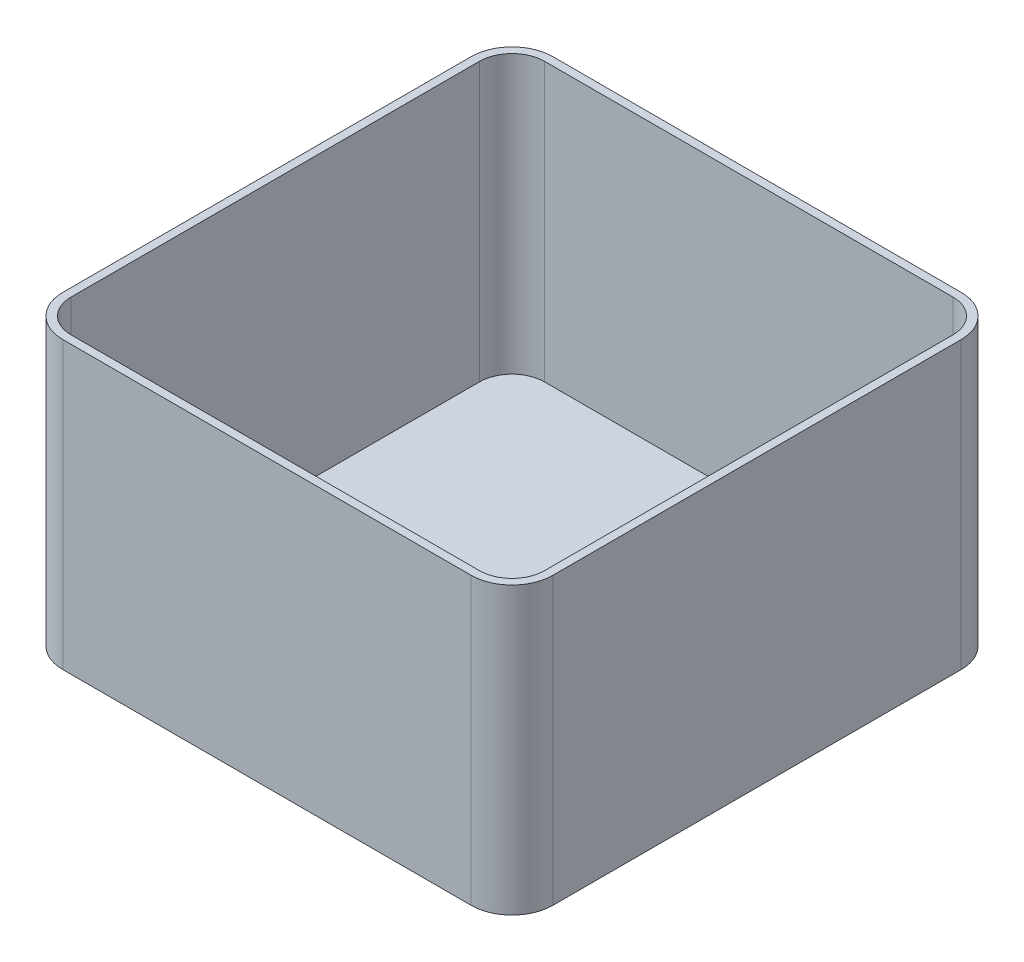
ISO-10303-21;
HEADER;
FILE_DESCRIPTION(('STEP AP214'),'2;1');
FILE_NAME('part.step','',(''),(''),'','','');
FILE_SCHEMA(('AUTOMOTIVE_DESIGN { 1 0 10303 214 1 1 1 1 }'));
ENDSEC;
DATA;
#1=APPLICATION_CONTEXT('core data for automotive mechanical design processes');
#2=APPLICATION_PROTOCOL_DEFINITION('international standard','automotive_design',2000,#1);
#3=PRODUCT_CONTEXT('',#1,'mechanical');
#4=PRODUCT('Part','Part','',(#3));
#5=PRODUCT_RELATED_PRODUCT_CATEGORY('part','',(#4));
#6=PRODUCT_DEFINITION_FORMATION('','',#4);
#7=PRODUCT_DEFINITION_CONTEXT('part definition',#1,'design');
#8=PRODUCT_DEFINITION('design','',#6,#7);
#9=PRODUCT_DEFINITION_SHAPE('','',#8);
#10=(LENGTH_UNIT() NAMED_UNIT(*) SI_UNIT(.MILLI.,.METRE.));
#11=(NAMED_UNIT(*) PLANE_ANGLE_UNIT() SI_UNIT($,.RADIAN.));
#12=(NAMED_UNIT(*) SI_UNIT($,.STERADIAN.) SOLID_ANGLE_UNIT());
#13=UNCERTAINTY_MEASURE_WITH_UNIT(LENGTH_MEASURE(1.E-05),#10,'distance_accuracy_value','');
#14=(GEOMETRIC_REPRESENTATION_CONTEXT(3) GLOBAL_UNCERTAINTY_ASSIGNED_CONTEXT((#13)) GLOBAL_UNIT_ASSIGNED_CONTEXT((#10,
#11,#12)) REPRESENTATION_CONTEXT('',''));
#15=CARTESIAN_POINT('',(0.,0.,0.));
#16=DIRECTION('',(0.,0.,1.));
#17=DIRECTION('',(1.,0.,0.));
#18=AXIS2_PLACEMENT_3D('',#15,#16,#17);
#19=CARTESIAN_POINT('',(-25.,35.,25.));
#20=DIRECTION('',(0.,-1.,0.));
#21=DIRECTION('',(0.,0.,-1.));
#22=AXIS2_PLACEMENT_3D('',#19,#20,#21);
#23=PLANE('',#22);
#24=CARTESIAN_POINT('',(-25.,35.,25.));
#25=DIRECTION('',(0.,1.,0.));
#26=DIRECTION('',(0.,0.,-1.));
#27=AXIS2_PLACEMENT_3D('',#24,#25,#26);
#28=CIRCLE('',#27,5.);
#29=CARTESIAN_POINT('',(-30.,35.,25.));
#30=VERTEX_POINT('',#29);
#31=CARTESIAN_POINT('',(-25.,35.,30.));
#32=VERTEX_POINT('',#31);
#33=EDGE_CURVE('E157',#30,#32,#28,.T.);
#34=ORIENTED_EDGE('',*,*,#33,.T.);
#35=DIRECTION('',(1.,0.,0.));
#36=VECTOR('',#35,1.);
#37=CARTESIAN_POINT('',(-25.,35.,30.));
#38=LINE('',#37,#36);
#39=CARTESIAN_POINT('',(25.,35.,30.));
#40=VERTEX_POINT('',#39);
#41=EDGE_CURVE('E98',#32,#40,#38,.T.);
#42=ORIENTED_EDGE('',*,*,#41,.T.);
#43=CARTESIAN_POINT('',(25.,35.,25.));
#44=DIRECTION('',(0.,1.,0.));
#45=DIRECTION('',(0.,0.,1.));
#46=AXIS2_PLACEMENT_3D('',#43,#44,#45);
#47=CIRCLE('',#46,5.);
#48=CARTESIAN_POINT('',(30.,35.,25.));
#49=VERTEX_POINT('',#48);
#50=EDGE_CURVE('E172',#40,#49,#47,.T.);
#51=ORIENTED_EDGE('',*,*,#50,.T.);
#52=DIRECTION('',(0.,0.,-1.));
#53=VECTOR('',#52,1.);
#54=CARTESIAN_POINT('',(30.,35.,25.));
#55=LINE('',#54,#53);
#56=CARTESIAN_POINT('',(30.,35.,-25.));
#57=VERTEX_POINT('',#56);
#58=EDGE_CURVE('E184',#49,#57,#55,.T.);
#59=ORIENTED_EDGE('',*,*,#58,.T.);
#60=CARTESIAN_POINT('',(25.,35.,-25.));
#61=DIRECTION('',(0.,1.,0.));
#62=DIRECTION('',(0.,0.,-1.));
#63=AXIS2_PLACEMENT_3D('',#60,#61,#62);
#64=CIRCLE('',#63,5.);
#65=CARTESIAN_POINT('',(25.,35.,-30.));
#66=VERTEX_POINT('',#65);
#67=EDGE_CURVE('E120',#57,#66,#64,.T.);
#68=ORIENTED_EDGE('',*,*,#67,.T.);
#69=DIRECTION('',(-1.,0.,0.));
#70=VECTOR('',#69,1.);
#71=CARTESIAN_POINT('',(-25.,35.,-30.));
#72=LINE('',#71,#70);
#73=CARTESIAN_POINT('',(-25.,35.,-30.));
#74=VERTEX_POINT('',#73);
#75=EDGE_CURVE('E113',#66,#74,#72,.T.);
#76=ORIENTED_EDGE('',*,*,#75,.T.);
#77=CARTESIAN_POINT('',(-25.,35.,-25.));
#78=DIRECTION('',(0.,1.,0.));
#79=DIRECTION('',(0.,0.,-1.));
#80=AXIS2_PLACEMENT_3D('',#77,#78,#79);
#81=CIRCLE('',#80,5.);
#82=CARTESIAN_POINT('',(-30.,35.,-25.));
#83=VERTEX_POINT('',#82);
#84=EDGE_CURVE('E117',#74,#83,#81,.T.);
#85=ORIENTED_EDGE('',*,*,#84,.T.);
#86=DIRECTION('',(0.,0.,1.));
#87=VECTOR('',#86,1.);
#88=CARTESIAN_POINT('',(-30.,35.,25.));
#89=LINE('',#88,#87);
#90=EDGE_CURVE('E57',#83,#30,#89,.T.);
#91=ORIENTED_EDGE('',*,*,#90,.T.);
#92=EDGE_LOOP('',(#34,#42,#51,#59,#68,#76,#85,#91));
#93=FACE_BOUND('',#92,.T.);
#94=CARTESIAN_POINT('',(-25.,35.,25.));
#95=DIRECTION('',(0.,-1.,0.));
#96=DIRECTION('',(0.,0.,-1.));
#97=AXIS2_PLACEMENT_3D('',#94,#95,#96);
#98=CIRCLE('',#97,4.);
#99=CARTESIAN_POINT('',(-29.,35.,25.));
#100=VERTEX_POINT('',#99);
#101=CARTESIAN_POINT('',(-25.,35.,29.));
#102=VERTEX_POINT('',#101);
#103=EDGE_CURVE('E210',#100,#102,#98,.F.);
#104=ORIENTED_EDGE('',*,*,#103,.F.);
#105=DIRECTION('',(0.,0.,1.));
#106=VECTOR('',#105,1.);
#107=CARTESIAN_POINT('',(-29.,35.,25.));
#108=LINE('',#107,#106);
#109=CARTESIAN_POINT('',(-29.,35.,-25.));
#110=VERTEX_POINT('',#109);
#111=EDGE_CURVE('E190',#110,#100,#108,.T.);
#112=ORIENTED_EDGE('',*,*,#111,.F.);
#113=CARTESIAN_POINT('',(-25.,35.,-25.));
#114=DIRECTION('',(0.,-1.,0.));
#115=DIRECTION('',(0.,0.,-1.));
#116=AXIS2_PLACEMENT_3D('',#113,#114,#115);
#117=CIRCLE('',#116,4.);
#118=CARTESIAN_POINT('',(-25.,35.,-29.));
#119=VERTEX_POINT('',#118);
#120=EDGE_CURVE('E193',#119,#110,#117,.F.);
#121=ORIENTED_EDGE('',*,*,#120,.F.);
#122=DIRECTION('',(-1.,0.,0.));
#123=VECTOR('',#122,1.);
#124=CARTESIAN_POINT('',(-25.,35.,-29.));
#125=LINE('',#124,#123);
#126=CARTESIAN_POINT('',(25.,35.,-29.));
#127=VERTEX_POINT('',#126);
#128=EDGE_CURVE('E195',#127,#119,#125,.T.);
#129=ORIENTED_EDGE('',*,*,#128,.F.);
#130=CARTESIAN_POINT('',(25.,35.,-25.));
#131=DIRECTION('',(0.,-1.,0.));
#132=DIRECTION('',(0.,0.,-1.));
#133=AXIS2_PLACEMENT_3D('',#130,#131,#132);
#134=CIRCLE('',#133,4.);
#135=CARTESIAN_POINT('',(29.,35.,-25.));
#136=VERTEX_POINT('',#135);
#137=EDGE_CURVE('E198',#136,#127,#134,.F.);
#138=ORIENTED_EDGE('',*,*,#137,.F.);
#139=DIRECTION('',(0.,0.,-1.));
#140=VECTOR('',#139,1.);
#141=CARTESIAN_POINT('',(29.,35.,25.));
#142=LINE('',#141,#140);
#143=CARTESIAN_POINT('',(29.,35.,25.));
#144=VERTEX_POINT('',#143);
#145=EDGE_CURVE('E201',#144,#136,#142,.T.);
#146=ORIENTED_EDGE('',*,*,#145,.F.);
#147=CARTESIAN_POINT('',(25.,35.,25.));
#148=DIRECTION('',(0.,-1.,0.));
#149=DIRECTION('',(0.,0.,-1.));
#150=AXIS2_PLACEMENT_3D('',#147,#148,#149);
#151=CIRCLE('',#150,4.);
#152=CARTESIAN_POINT('',(25.,35.,29.));
#153=VERTEX_POINT('',#152);
#154=EDGE_CURVE('E204',#153,#144,#151,.F.);
#155=ORIENTED_EDGE('',*,*,#154,.F.);
#156=DIRECTION('',(1.,0.,0.));
#157=VECTOR('',#156,1.);
#158=CARTESIAN_POINT('',(-25.,35.,29.));
#159=LINE('',#158,#157);
#160=EDGE_CURVE('E207',#102,#153,#159,.T.);
#161=ORIENTED_EDGE('',*,*,#160,.F.);
#162=EDGE_LOOP('',(#104,#112,#121,#129,#138,#146,#155,#161));
#163=FACE_BOUND('',#162,.T.);
#164=ADVANCED_FACE('F33',(#93,#163),#23,.F.);
#165=CARTESIAN_POINT('',(-25.,35.,25.));
#166=DIRECTION('',(0.,-1.,0.));
#167=DIRECTION('',(0.,0.,-1.));
#168=AXIS2_PLACEMENT_3D('',#165,#166,#167);
#169=CYLINDRICAL_SURFACE('',#168,5.);
#170=CARTESIAN_POINT('',(-25.,0.,25.));
#171=DIRECTION('',(0.,1.,0.));
#172=DIRECTION('',(0.,0.,-1.));
#173=AXIS2_PLACEMENT_3D('',#170,#171,#172);
#174=CIRCLE('',#173,5.);
#175=CARTESIAN_POINT('',(-30.,0.,25.));
#176=VERTEX_POINT('',#175);
#177=CARTESIAN_POINT('',(-25.,0.,30.));
#178=VERTEX_POINT('',#177);
#179=EDGE_CURVE('E141',#176,#178,#174,.T.);
#180=ORIENTED_EDGE('',*,*,#179,.T.);
#181=DIRECTION('',(0.,-1.,0.));
#182=VECTOR('',#181,1.);
#183=CARTESIAN_POINT('',(-25.,35.,30.));
#184=LINE('',#183,#182);
#185=EDGE_CURVE('E11',#32,#178,#184,.T.);
#186=ORIENTED_EDGE('',*,*,#185,.F.);
#187=ORIENTED_EDGE('',*,*,#33,.F.);
#188=DIRECTION('',(0.,-1.,0.));
#189=VECTOR('',#188,1.);
#190=CARTESIAN_POINT('',(-30.,35.,25.));
#191=LINE('',#190,#189);
#192=EDGE_CURVE('E137',#30,#176,#191,.T.);
#193=ORIENTED_EDGE('',*,*,#192,.T.);
#194=EDGE_LOOP('',(#180,#186,#187,#193));
#195=FACE_BOUND('',#194,.T.);
#196=ADVANCED_FACE('F35',(#195),#169,.T.);
#197=CARTESIAN_POINT('',(-25.,35.,30.));
#198=DIRECTION('',(0.,0.,-1.));
#199=DIRECTION('',(-1.,0.,0.));
#200=AXIS2_PLACEMENT_3D('',#197,#198,#199);
#201=PLANE('',#200);
#202=DIRECTION('',(1.,0.,0.));
#203=VECTOR('',#202,1.);
#204=CARTESIAN_POINT('',(-25.,0.,30.));
#205=LINE('',#204,#203);
#206=CARTESIAN_POINT('',(25.,0.,30.));
#207=VERTEX_POINT('',#206);
#208=EDGE_CURVE('E144',#178,#207,#205,.T.);
#209=ORIENTED_EDGE('',*,*,#208,.T.);
#210=DIRECTION('',(0.,-1.,0.));
#211=VECTOR('',#210,1.);
#212=CARTESIAN_POINT('',(25.,35.,30.));
#213=LINE('',#212,#211);
#214=EDGE_CURVE('E41',#40,#207,#213,.T.);
#215=ORIENTED_EDGE('',*,*,#214,.F.);
#216=ORIENTED_EDGE('',*,*,#41,.F.);
#217=ORIENTED_EDGE('',*,*,#185,.T.);
#218=EDGE_LOOP('',(#209,#215,#216,#217));
#219=FACE_BOUND('',#218,.T.);
#220=ADVANCED_FACE('F329',(#219),#201,.F.);
#221=CARTESIAN_POINT('',(25.,35.,25.));
#222=DIRECTION('',(0.,-1.,0.));
#223=DIRECTION('',(0.,0.,-1.));
#224=AXIS2_PLACEMENT_3D('',#221,#222,#223);
#225=CYLINDRICAL_SURFACE('',#224,5.);
#226=CARTESIAN_POINT('',(25.,0.,25.));
#227=DIRECTION('',(0.,1.,0.));
#228=DIRECTION('',(0.,0.,1.));
#229=AXIS2_PLACEMENT_3D('',#226,#227,#228);
#230=CIRCLE('',#229,5.);
#231=CARTESIAN_POINT('',(30.,0.,25.));
#232=VERTEX_POINT('',#231);
#233=EDGE_CURVE('E147',#207,#232,#230,.T.);
#234=ORIENTED_EDGE('',*,*,#233,.T.);
#235=DIRECTION('',(0.,-1.,0.));
#236=VECTOR('',#235,1.);
#237=CARTESIAN_POINT('',(30.,35.,25.));
#238=LINE('',#237,#236);
#239=EDGE_CURVE('E164',#49,#232,#238,.T.);
#240=ORIENTED_EDGE('',*,*,#239,.F.);
#241=ORIENTED_EDGE('',*,*,#50,.F.);
#242=ORIENTED_EDGE('',*,*,#214,.T.);
#243=EDGE_LOOP('',(#234,#240,#241,#242));
#244=FACE_BOUND('',#243,.T.);
#245=ADVANCED_FACE('F170',(#244),#225,.T.);
#246=CARTESIAN_POINT('',(30.,35.,25.));
#247=DIRECTION('',(-1.,0.,0.));
#248=DIRECTION('',(0.,0.,1.));
#249=AXIS2_PLACEMENT_3D('',#246,#247,#248);
#250=PLANE('',#249);
#251=DIRECTION('',(0.,0.,-1.));
#252=VECTOR('',#251,1.);
#253=CARTESIAN_POINT('',(30.,0.,25.));
#254=LINE('',#253,#252);
#255=CARTESIAN_POINT('',(30.,0.,-25.));
#256=VERTEX_POINT('',#255);
#257=EDGE_CURVE('E149',#232,#256,#254,.T.);
#258=ORIENTED_EDGE('',*,*,#257,.T.);
#259=DIRECTION('',(0.,-1.,0.));
#260=VECTOR('',#259,1.);
#261=CARTESIAN_POINT('',(30.,35.,-25.));
#262=LINE('',#261,#260);
#263=EDGE_CURVE('E161',#57,#256,#262,.T.);
#264=ORIENTED_EDGE('',*,*,#263,.F.);
#265=ORIENTED_EDGE('',*,*,#58,.F.);
#266=ORIENTED_EDGE('',*,*,#239,.T.);
#267=EDGE_LOOP('',(#258,#264,#265,#266));
#268=FACE_BOUND('',#267,.T.);
#269=ADVANCED_FACE('F180',(#268),#250,.F.);
#270=CARTESIAN_POINT('',(25.,35.,-25.));
#271=DIRECTION('',(0.,-1.,0.));
#272=DIRECTION('',(0.,0.,-1.));
#273=AXIS2_PLACEMENT_3D('',#270,#271,#272);
#274=CYLINDRICAL_SURFACE('',#273,5.);
#275=CARTESIAN_POINT('',(25.,0.,-25.));
#276=DIRECTION('',(0.,1.,0.));
#277=DIRECTION('',(0.,0.,-1.));
#278=AXIS2_PLACEMENT_3D('',#275,#276,#277);
#279=CIRCLE('',#278,5.);
#280=CARTESIAN_POINT('',(25.,0.,-30.));
#281=VERTEX_POINT('',#280);
#282=EDGE_CURVE('E151',#256,#281,#279,.T.);
#283=ORIENTED_EDGE('',*,*,#282,.T.);
#284=DIRECTION('',(0.,-1.,0.));
#285=VECTOR('',#284,1.);
#286=CARTESIAN_POINT('',(25.,35.,-30.));
#287=LINE('',#286,#285);
#288=EDGE_CURVE('E132',#66,#281,#287,.T.);
#289=ORIENTED_EDGE('',*,*,#288,.F.);
#290=ORIENTED_EDGE('',*,*,#67,.F.);
#291=ORIENTED_EDGE('',*,*,#263,.T.);
#292=EDGE_LOOP('',(#283,#289,#290,#291));
#293=FACE_BOUND('',#292,.T.);
#294=ADVANCED_FACE('F183',(#293),#274,.T.);
#295=CARTESIAN_POINT('',(-25.,35.,-30.));
#296=DIRECTION('',(0.,0.,1.));
#297=DIRECTION('',(1.,0.,0.));
#298=AXIS2_PLACEMENT_3D('',#295,#296,#297);
#299=PLANE('',#298);
#300=DIRECTION('',(-1.,0.,0.));
#301=VECTOR('',#300,1.);
#302=CARTESIAN_POINT('',(-25.,0.,-30.));
#303=LINE('',#302,#301);
#304=CARTESIAN_POINT('',(-25.,0.,-30.));
#305=VERTEX_POINT('',#304);
#306=EDGE_CURVE('E129',#281,#305,#303,.T.);
#307=ORIENTED_EDGE('',*,*,#306,.T.);
#308=DIRECTION('',(0.,-1.,0.));
#309=VECTOR('',#308,1.);
#310=CARTESIAN_POINT('',(-25.,35.,-30.));
#311=LINE('',#310,#309);
#312=EDGE_CURVE('E126',#74,#305,#311,.T.);
#313=ORIENTED_EDGE('',*,*,#312,.F.);
#314=ORIENTED_EDGE('',*,*,#75,.F.);
#315=ORIENTED_EDGE('',*,*,#288,.T.);
#316=EDGE_LOOP('',(#307,#313,#314,#315));
#317=FACE_BOUND('',#316,.T.);
#318=ADVANCED_FACE('F127',(#317),#299,.F.);
#319=CARTESIAN_POINT('',(-25.,35.,-25.));
#320=DIRECTION('',(0.,-1.,0.));
#321=DIRECTION('',(0.,0.,-1.));
#322=AXIS2_PLACEMENT_3D('',#319,#320,#321);
#323=CYLINDRICAL_SURFACE('',#322,5.);
#324=CARTESIAN_POINT('',(-25.,0.,-25.));
#325=DIRECTION('',(0.,1.,0.));
#326=DIRECTION('',(0.,0.,-1.));
#327=AXIS2_PLACEMENT_3D('',#324,#325,#326);
#328=CIRCLE('',#327,5.);
#329=CARTESIAN_POINT('',(-30.,0.,-25.));
#330=VERTEX_POINT('',#329);
#331=EDGE_CURVE('E154',#305,#330,#328,.T.);
#332=ORIENTED_EDGE('',*,*,#331,.T.);
#333=DIRECTION('',(0.,-1.,0.));
#334=VECTOR('',#333,1.);
#335=CARTESIAN_POINT('',(-30.,35.,-25.));
#336=LINE('',#335,#334);
#337=EDGE_CURVE('E133',#83,#330,#336,.T.);
#338=ORIENTED_EDGE('',*,*,#337,.F.);
#339=ORIENTED_EDGE('',*,*,#84,.F.);
#340=ORIENTED_EDGE('',*,*,#312,.T.);
#341=EDGE_LOOP('',(#332,#338,#339,#340));
#342=FACE_BOUND('',#341,.T.);
#343=ADVANCED_FACE('F135',(#342),#323,.T.);
#344=CARTESIAN_POINT('',(-30.,35.,25.));
#345=DIRECTION('',(1.,0.,0.));
#346=DIRECTION('',(0.,0.,-1.));
#347=AXIS2_PLACEMENT_3D('',#344,#345,#346);
#348=PLANE('',#347);
#349=DIRECTION('',(0.,0.,1.));
#350=VECTOR('',#349,1.);
#351=CARTESIAN_POINT('',(-30.,0.,25.));
#352=LINE('',#351,#350);
#353=EDGE_CURVE('E90',#330,#176,#352,.T.);
#354=ORIENTED_EDGE('',*,*,#353,.T.);
#355=ORIENTED_EDGE('',*,*,#192,.F.);
#356=ORIENTED_EDGE('',*,*,#90,.F.);
#357=ORIENTED_EDGE('',*,*,#337,.T.);
#358=EDGE_LOOP('',(#354,#355,#356,#357));
#359=FACE_BOUND('',#358,.T.);
#360=ADVANCED_FACE('F335',(#359),#348,.F.);
#361=CARTESIAN_POINT('',(-25.,0.,25.));
#362=DIRECTION('',(0.,-1.,0.));
#363=DIRECTION('',(0.,0.,-1.));
#364=AXIS2_PLACEMENT_3D('',#361,#362,#363);
#365=PLANE('',#364);
#366=ORIENTED_EDGE('',*,*,#179,.F.);
#367=ORIENTED_EDGE('',*,*,#353,.F.);
#368=ORIENTED_EDGE('',*,*,#331,.F.);
#369=ORIENTED_EDGE('',*,*,#306,.F.);
#370=ORIENTED_EDGE('',*,*,#282,.F.);
#371=ORIENTED_EDGE('',*,*,#257,.F.);
#372=ORIENTED_EDGE('',*,*,#233,.F.);
#373=ORIENTED_EDGE('',*,*,#208,.F.);
#374=EDGE_LOOP('',(#366,#367,#368,#369,#370,#371,#372,#373));
#375=FACE_BOUND('',#374,.T.);
#376=ADVANCED_FACE('F176',(#375),#365,.T.);
#377=CARTESIAN_POINT('',(-25.,35.,25.));
#378=DIRECTION('',(0.,-1.,0.));
#379=DIRECTION('',(0.,0.,-1.));
#380=AXIS2_PLACEMENT_3D('',#377,#378,#379);
#381=CYLINDRICAL_SURFACE('',#380,4.);
#382=CARTESIAN_POINT('',(-25.,1.,25.));
#383=DIRECTION('',(0.,-1.,0.));
#384=DIRECTION('',(0.,0.,-1.));
#385=AXIS2_PLACEMENT_3D('',#382,#383,#384);
#386=CIRCLE('',#385,4.);
#387=CARTESIAN_POINT('',(-29.,1.,25.));
#388=VERTEX_POINT('',#387);
#389=CARTESIAN_POINT('',(-25.,1.,29.));
#390=VERTEX_POINT('',#389);
#391=EDGE_CURVE('E250',#388,#390,#386,.F.);
#392=ORIENTED_EDGE('',*,*,#391,.F.);
#393=DIRECTION('',(0.,-1.,0.));
#394=VECTOR('',#393,1.);
#395=CARTESIAN_POINT('',(-29.,35.,25.));
#396=LINE('',#395,#394);
#397=EDGE_CURVE('E192',#100,#388,#396,.T.);
#398=ORIENTED_EDGE('',*,*,#397,.F.);
#399=ORIENTED_EDGE('',*,*,#103,.T.);
#400=DIRECTION('',(0.,1.,0.));
#401=VECTOR('',#400,1.);
#402=CARTESIAN_POINT('',(-25.,35.,29.));
#403=LINE('',#402,#401);
#404=EDGE_CURVE('E145',#102,#390,#403,.F.);
#405=ORIENTED_EDGE('',*,*,#404,.T.);
#406=EDGE_LOOP('',(#392,#398,#399,#405));
#407=FACE_BOUND('',#406,.T.);
#408=ADVANCED_FACE('F266',(#407),#381,.F.);
#409=CARTESIAN_POINT('',(-25.,35.,29.));
#410=DIRECTION('',(0.,0.,-1.));
#411=DIRECTION('',(-1.,0.,0.));
#412=AXIS2_PLACEMENT_3D('',#409,#410,#411);
#413=PLANE('',#412);
#414=DIRECTION('',(1.,0.,0.));
#415=VECTOR('',#414,1.);
#416=CARTESIAN_POINT('',(-25.,1.,29.));
#417=LINE('',#416,#415);
#418=CARTESIAN_POINT('',(25.,1.,29.));
#419=VERTEX_POINT('',#418);
#420=EDGE_CURVE('E245',#390,#419,#417,.T.);
#421=ORIENTED_EDGE('',*,*,#420,.F.);
#422=ORIENTED_EDGE('',*,*,#404,.F.);
#423=ORIENTED_EDGE('',*,*,#160,.T.);
#424=DIRECTION('',(0.,-1.,0.));
#425=VECTOR('',#424,1.);
#426=CARTESIAN_POINT('',(25.,35.,29.));
#427=LINE('',#426,#425);
#428=EDGE_CURVE('E242',#153,#419,#427,.T.);
#429=ORIENTED_EDGE('',*,*,#428,.T.);
#430=EDGE_LOOP('',(#421,#422,#423,#429));
#431=FACE_BOUND('',#430,.T.);
#432=ADVANCED_FACE('F295',(#431),#413,.T.);
#433=CARTESIAN_POINT('',(25.,35.,25.));
#434=DIRECTION('',(0.,-1.,0.));
#435=DIRECTION('',(0.,0.,-1.));
#436=AXIS2_PLACEMENT_3D('',#433,#434,#435);
#437=CYLINDRICAL_SURFACE('',#436,4.);
#438=CARTESIAN_POINT('',(25.,1.,25.));
#439=DIRECTION('',(0.,-1.,0.));
#440=DIRECTION('',(0.,0.,-1.));
#441=AXIS2_PLACEMENT_3D('',#438,#439,#440);
#442=CIRCLE('',#441,4.);
#443=CARTESIAN_POINT('',(29.,1.,25.));
#444=VERTEX_POINT('',#443);
#445=EDGE_CURVE('E239',#419,#444,#442,.F.);
#446=ORIENTED_EDGE('',*,*,#445,.F.);
#447=ORIENTED_EDGE('',*,*,#428,.F.);
#448=ORIENTED_EDGE('',*,*,#154,.T.);
#449=DIRECTION('',(0.,1.,0.));
#450=VECTOR('',#449,1.);
#451=CARTESIAN_POINT('',(29.,35.,25.));
#452=LINE('',#451,#450);
#453=EDGE_CURVE('E236',#144,#444,#452,.F.);
#454=ORIENTED_EDGE('',*,*,#453,.T.);
#455=EDGE_LOOP('',(#446,#447,#448,#454));
#456=FACE_BOUND('',#455,.T.);
#457=ADVANCED_FACE('F301',(#456),#437,.F.);
#458=CARTESIAN_POINT('',(29.,35.,25.));
#459=DIRECTION('',(-1.,0.,0.));
#460=DIRECTION('',(0.,0.,1.));
#461=AXIS2_PLACEMENT_3D('',#458,#459,#460);
#462=PLANE('',#461);
#463=DIRECTION('',(0.,0.,-1.));
#464=VECTOR('',#463,1.);
#465=CARTESIAN_POINT('',(29.,1.,25.));
#466=LINE('',#465,#464);
#467=CARTESIAN_POINT('',(29.,1.,-25.));
#468=VERTEX_POINT('',#467);
#469=EDGE_CURVE('E233',#444,#468,#466,.T.);
#470=ORIENTED_EDGE('',*,*,#469,.F.);
#471=ORIENTED_EDGE('',*,*,#453,.F.);
#472=ORIENTED_EDGE('',*,*,#145,.T.);
#473=DIRECTION('',(0.,-1.,0.));
#474=VECTOR('',#473,1.);
#475=CARTESIAN_POINT('',(29.,35.,-25.));
#476=LINE('',#475,#474);
#477=EDGE_CURVE('E230',#136,#468,#476,.T.);
#478=ORIENTED_EDGE('',*,*,#477,.T.);
#479=EDGE_LOOP('',(#470,#471,#472,#478));
#480=FACE_BOUND('',#479,.T.);
#481=ADVANCED_FACE('F400',(#480),#462,.T.);
#482=CARTESIAN_POINT('',(25.,35.,-25.));
#483=DIRECTION('',(0.,-1.,0.));
#484=DIRECTION('',(0.,0.,-1.));
#485=AXIS2_PLACEMENT_3D('',#482,#483,#484);
#486=CYLINDRICAL_SURFACE('',#485,4.);
#487=CARTESIAN_POINT('',(25.,1.,-25.));
#488=DIRECTION('',(0.,-1.,0.));
#489=DIRECTION('',(0.,0.,-1.));
#490=AXIS2_PLACEMENT_3D('',#487,#488,#489);
#491=CIRCLE('',#490,4.);
#492=CARTESIAN_POINT('',(25.,1.,-29.));
#493=VERTEX_POINT('',#492);
#494=EDGE_CURVE('E227',#468,#493,#491,.F.);
#495=ORIENTED_EDGE('',*,*,#494,.F.);
#496=ORIENTED_EDGE('',*,*,#477,.F.);
#497=ORIENTED_EDGE('',*,*,#137,.T.);
#498=DIRECTION('',(0.,1.,0.));
#499=VECTOR('',#498,1.);
#500=CARTESIAN_POINT('',(25.,35.,-29.));
#501=LINE('',#500,#499);
#502=EDGE_CURVE('E224',#127,#493,#501,.F.);
#503=ORIENTED_EDGE('',*,*,#502,.T.);
#504=EDGE_LOOP('',(#495,#496,#497,#503));
#505=FACE_BOUND('',#504,.T.);
#506=ADVANCED_FACE('F322',(#505),#486,.F.);
#507=CARTESIAN_POINT('',(-25.,35.,-29.));
#508=DIRECTION('',(0.,0.,1.));
#509=DIRECTION('',(1.,0.,0.));
#510=AXIS2_PLACEMENT_3D('',#507,#508,#509);
#511=PLANE('',#510);
#512=DIRECTION('',(-1.,0.,0.));
#513=VECTOR('',#512,1.);
#514=CARTESIAN_POINT('',(-25.,1.,-29.));
#515=LINE('',#514,#513);
#516=CARTESIAN_POINT('',(-25.,1.,-29.));
#517=VERTEX_POINT('',#516);
#518=EDGE_CURVE('E221',#493,#517,#515,.T.);
#519=ORIENTED_EDGE('',*,*,#518,.F.);
#520=ORIENTED_EDGE('',*,*,#502,.F.);
#521=ORIENTED_EDGE('',*,*,#128,.T.);
#522=DIRECTION('',(0.,-1.,0.));
#523=VECTOR('',#522,1.);
#524=CARTESIAN_POINT('',(-25.,35.,-29.));
#525=LINE('',#524,#523);
#526=EDGE_CURVE('E218',#119,#517,#525,.T.);
#527=ORIENTED_EDGE('',*,*,#526,.T.);
#528=EDGE_LOOP('',(#519,#520,#521,#527));
#529=FACE_BOUND('',#528,.T.);
#530=ADVANCED_FACE('F312',(#529),#511,.T.);
#531=CARTESIAN_POINT('',(-25.,35.,-25.));
#532=DIRECTION('',(0.,-1.,0.));
#533=DIRECTION('',(0.,0.,-1.));
#534=AXIS2_PLACEMENT_3D('',#531,#532,#533);
#535=CYLINDRICAL_SURFACE('',#534,4.);
#536=CARTESIAN_POINT('',(-25.,1.,-25.));
#537=DIRECTION('',(0.,-1.,0.));
#538=DIRECTION('',(0.,0.,-1.));
#539=AXIS2_PLACEMENT_3D('',#536,#537,#538);
#540=CIRCLE('',#539,4.);
#541=CARTESIAN_POINT('',(-29.,1.,-25.));
#542=VERTEX_POINT('',#541);
#543=EDGE_CURVE('E216',#517,#542,#540,.F.);
#544=ORIENTED_EDGE('',*,*,#543,.F.);
#545=ORIENTED_EDGE('',*,*,#526,.F.);
#546=ORIENTED_EDGE('',*,*,#120,.T.);
#547=DIRECTION('',(0.,1.,0.));
#548=VECTOR('',#547,1.);
#549=CARTESIAN_POINT('',(-29.,35.,-25.));
#550=LINE('',#549,#548);
#551=EDGE_CURVE('E48',#110,#542,#550,.F.);
#552=ORIENTED_EDGE('',*,*,#551,.T.);
#553=EDGE_LOOP('',(#544,#545,#546,#552));
#554=FACE_BOUND('',#553,.T.);
#555=ADVANCED_FACE('F314',(#554),#535,.F.);
#556=CARTESIAN_POINT('',(-29.,35.,25.));
#557=DIRECTION('',(1.,0.,0.));
#558=DIRECTION('',(0.,0.,-1.));
#559=AXIS2_PLACEMENT_3D('',#556,#557,#558);
#560=PLANE('',#559);
#561=DIRECTION('',(0.,0.,1.));
#562=VECTOR('',#561,1.);
#563=CARTESIAN_POINT('',(-29.,1.,25.));
#564=LINE('',#563,#562);
#565=EDGE_CURVE('E213',#542,#388,#564,.T.);
#566=ORIENTED_EDGE('',*,*,#565,.F.);
#567=ORIENTED_EDGE('',*,*,#551,.F.);
#568=ORIENTED_EDGE('',*,*,#111,.T.);
#569=ORIENTED_EDGE('',*,*,#397,.T.);
#570=EDGE_LOOP('',(#566,#567,#568,#569));
#571=FACE_BOUND('',#570,.T.);
#572=ADVANCED_FACE('F290',(#571),#560,.T.);
#573=CARTESIAN_POINT('',(-25.,1.,25.));
#574=DIRECTION('',(0.,-1.,0.));
#575=DIRECTION('',(0.,0.,-1.));
#576=AXIS2_PLACEMENT_3D('',#573,#574,#575);
#577=PLANE('',#576);
#578=ORIENTED_EDGE('',*,*,#391,.T.);
#579=ORIENTED_EDGE('',*,*,#420,.T.);
#580=ORIENTED_EDGE('',*,*,#445,.T.);
#581=ORIENTED_EDGE('',*,*,#469,.T.);
#582=ORIENTED_EDGE('',*,*,#494,.T.);
#583=ORIENTED_EDGE('',*,*,#518,.T.);
#584=ORIENTED_EDGE('',*,*,#543,.T.);
#585=ORIENTED_EDGE('',*,*,#565,.T.);
#586=EDGE_LOOP('',(#578,#579,#580,#581,#582,#583,#584,#585));
#587=FACE_BOUND('',#586,.T.);
#588=ADVANCED_FACE('F259',(#587),#577,.F.);
#589=CLOSED_SHELL('',(#164,#196,#220,#245,#269,#294,#318,#343,#360,#376,#408,#432,#457,#481,
#506,#530,#555,#572,#588));
#590=MANIFOLD_SOLID_BREP('B2',#589);
#591=ADVANCED_BREP_SHAPE_REPRESENTATION('',(#18,#590),#14);
#592=SHAPE_DEFINITION_REPRESENTATION(#9,#591);
ENDSEC;
END-ISO-10303-21;
